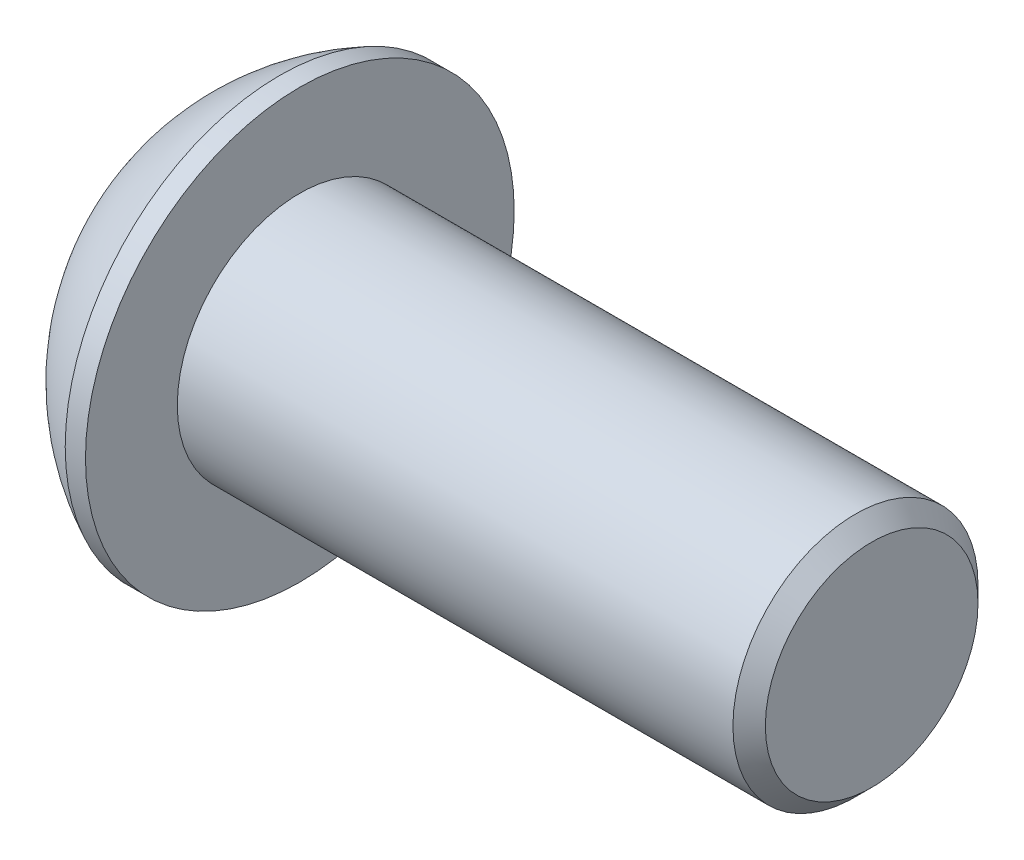
ISO-10303-21;
HEADER;
FILE_DESCRIPTION(('STEP AP214'),'2;1');
FILE_NAME('part.step','',(''),(''),'','','');
FILE_SCHEMA(('AUTOMOTIVE_DESIGN { 1 0 10303 214 1 1 1 1 }'));
ENDSEC;
DATA;
#1=APPLICATION_CONTEXT('core data for automotive mechanical design processes');
#2=APPLICATION_PROTOCOL_DEFINITION('international standard','automotive_design',2000,#1);
#3=PRODUCT_CONTEXT('',#1,'mechanical');
#4=PRODUCT('Part','Part','',(#3));
#5=PRODUCT_RELATED_PRODUCT_CATEGORY('part','',(#4));
#6=PRODUCT_DEFINITION_FORMATION('','',#4);
#7=PRODUCT_DEFINITION_CONTEXT('part definition',#1,'design');
#8=PRODUCT_DEFINITION('design','',#6,#7);
#9=PRODUCT_DEFINITION_SHAPE('','',#8);
#10=(LENGTH_UNIT() NAMED_UNIT(*) SI_UNIT(.MILLI.,.METRE.));
#11=(NAMED_UNIT(*) PLANE_ANGLE_UNIT() SI_UNIT($,.RADIAN.));
#12=(NAMED_UNIT(*) SI_UNIT($,.STERADIAN.) SOLID_ANGLE_UNIT());
#13=UNCERTAINTY_MEASURE_WITH_UNIT(LENGTH_MEASURE(1.E-05),#10,'distance_accuracy_value','');
#14=(GEOMETRIC_REPRESENTATION_CONTEXT(3) GLOBAL_UNCERTAINTY_ASSIGNED_CONTEXT((#13)) GLOBAL_UNIT_ASSIGNED_CONTEXT((#10,
#11,#12)) REPRESENTATION_CONTEXT('',''));
#15=CARTESIAN_POINT('',(0.,0.,0.));
#16=DIRECTION('',(0.,0.,1.));
#17=DIRECTION('',(1.,0.,0.));
#18=AXIS2_PLACEMENT_3D('',#15,#16,#17);
#19=CARTESIAN_POINT('',(0.,0.,0.));
#20=DIRECTION('',(-1.,0.,0.));
#21=DIRECTION('',(0.,0.,1.));
#22=AXIS2_PLACEMENT_3D('',#19,#20,#21);
#23=PLANE('',#22);
#24=CARTESIAN_POINT('',(0.,0.,0.));
#25=DIRECTION('',(-1.,0.,0.));
#26=DIRECTION('',(0.,0.,1.));
#27=AXIS2_PLACEMENT_3D('',#24,#25,#26);
#28=CIRCLE('',#27,4.1656);
#29=CARTESIAN_POINT('',(0.,4.1656,0.));
#30=VERTEX_POINT('',#29);
#31=EDGE_CURVE('E11',#30,#30,#28,.T.);
#32=ORIENTED_EDGE('',*,*,#31,.T.);
#33=EDGE_LOOP('',(#32));
#34=FACE_BOUND('',#33,.T.);
#35=DIRECTION('',(0.,-1.,0.));
#36=VECTOR('',#35,1.);
#37=CARTESIAN_POINT('',(0.,-1.6057843036971,2.7813));
#38=LINE('',#37,#36);
#39=CARTESIAN_POINT('',(0.,1.60578430369711,2.7813));
#40=VERTEX_POINT('',#39);
#41=CARTESIAN_POINT('',(0.,-1.6057843036971,2.7813));
#42=VERTEX_POINT('',#41);
#43=EDGE_CURVE('E46',#40,#42,#38,.T.);
#44=ORIENTED_EDGE('',*,*,#43,.T.);
#45=DIRECTION('',(0.,-0.500000000000001,-0.866025403784438));
#46=VECTOR('',#45,1.);
#47=CARTESIAN_POINT('',(0.,-3.21156860739421,0.));
#48=LINE('',#47,#46);
#49=CARTESIAN_POINT('',(0.,-3.21156860739421,0.));
#50=VERTEX_POINT('',#49);
#51=EDGE_CURVE('E362',#42,#50,#48,.T.);
#52=ORIENTED_EDGE('',*,*,#51,.T.);
#53=DIRECTION('',(0.,0.5,-0.866025403784438));
#54=VECTOR('',#53,1.);
#55=CARTESIAN_POINT('',(0.,-1.6057843036971,-2.7813));
#56=LINE('',#55,#54);
#57=CARTESIAN_POINT('',(0.,-1.6057843036971,-2.7813));
#58=VERTEX_POINT('',#57);
#59=EDGE_CURVE('E126',#50,#58,#56,.T.);
#60=ORIENTED_EDGE('',*,*,#59,.T.);
#61=DIRECTION('',(0.,1.,0.));
#62=VECTOR('',#61,1.);
#63=CARTESIAN_POINT('',(0.,1.60578430369711,-2.7813));
#64=LINE('',#63,#62);
#65=CARTESIAN_POINT('',(0.,1.60578430369711,-2.7813));
#66=VERTEX_POINT('',#65);
#67=EDGE_CURVE('E365',#58,#66,#64,.T.);
#68=ORIENTED_EDGE('',*,*,#67,.T.);
#69=DIRECTION('',(0.,0.499999999999999,0.866025403784439));
#70=VECTOR('',#69,1.);
#71=CARTESIAN_POINT('',(0.,3.21156860739421,0.));
#72=LINE('',#71,#70);
#73=CARTESIAN_POINT('',(0.,3.21156860739421,0.));
#74=VERTEX_POINT('',#73);
#75=EDGE_CURVE('E367',#66,#74,#72,.T.);
#76=ORIENTED_EDGE('',*,*,#75,.T.);
#77=DIRECTION('',(0.,-0.499999999999999,0.866025403784439));
#78=VECTOR('',#77,1.);
#79=CARTESIAN_POINT('',(0.,1.60578430369711,2.7813));
#80=LINE('',#79,#78);
#81=EDGE_CURVE('E369',#74,#40,#80,.T.);
#82=ORIENTED_EDGE('',*,*,#81,.T.);
#83=EDGE_LOOP('',(#44,#52,#60,#68,#76,#82));
#84=FACE_BOUND('',#83,.T.);
#85=ADVANCED_FACE('F32',(#34,#84),#23,.T.);
#86=CARTESIAN_POINT('',(8.23322857142858,0.,0.));
#87=DIRECTION('',(-1.,0.,0.));
#88=DIRECTION('',(0.,1.,0.));
#89=AXIS2_PLACEMENT_3D('',#86,#87,#88);
#90=SPHERICAL_SURFACE('',#89,9.22704048270018);
#91=CARTESIAN_POINT('',(4.2672,0.,0.));
#92=DIRECTION('',(-1.,0.,0.));
#93=DIRECTION('',(0.,0.,1.));
#94=AXIS2_PLACEMENT_3D('',#91,#92,#93);
#95=CIRCLE('',#94,8.3312);
#96=CARTESIAN_POINT('',(4.2672,8.3312,0.));
#97=VERTEX_POINT('',#96);
#98=EDGE_CURVE('E39',#97,#97,#95,.T.);
#99=CARTESIAN_POINT('',(4.2672,8.3312,0.));
#100=CARTESIAN_POINT('',(4.21008789706775,8.30401216143445,0.));
#101=CARTESIAN_POINT('',(4.15325544879328,8.27623687717214,0.));
#102=CARTESIAN_POINT('',(4.04017370315191,8.21952355207569,0.));
#103=CARTESIAN_POINT('',(3.983924405785,8.19058551124157,0.));
#104=CARTESIAN_POINT('',(3.87203280355074,8.13155880782323,0.));
#105=CARTESIAN_POINT('',(3.81639049868339,8.10147014523901,0.));
#106=CARTESIAN_POINT('',(3.70573640024065,8.04015495154151,0.));
#107=CARTESIAN_POINT('',(3.65072460666526,8.00892842042822,0.));
#108=CARTESIAN_POINT('',(3.54135480064451,7.94535068882439,0.));
#109=CARTESIAN_POINT('',(3.48699678819915,7.91299948833385,0.));
#110=CARTESIAN_POINT('',(3.37895753302873,7.84718610224342,0.));
#111=CARTESIAN_POINT('',(3.32527629030366,7.81372391664353,0.));
#112=CARTESIAN_POINT('',(3.21861327820971,7.74570271193545,0.));
#113=CARTESIAN_POINT('',(3.16563150884082,7.71114369282725,0.));
#114=CARTESIAN_POINT('',(3.06038985092671,7.6409434372658,0.));
#115=CARTESIAN_POINT('',(3.00812996238149,7.60530220081255,0.));
#116=CARTESIAN_POINT('',(2.90435416836898,7.53295258424359,0.));
#117=CARTESIAN_POINT('',(2.85283826290169,7.49624420412788,0.));
#118=CARTESIAN_POINT('',(2.75057222262265,7.42177582529164,0.));
#119=CARTESIAN_POINT('',(2.69982208781091,7.3840158265711,0.));
#120=CARTESIAN_POINT('',(2.59910905256031,7.30746018033003,0.));
#121=CARTESIAN_POINT('',(2.54914615212146,7.2686645328095,0.));
#122=CARTESIAN_POINT('',(2.45002871638783,7.1900539967829,0.));
#123=CARTESIAN_POINT('',(2.40087418109305,7.15023910827685,0.));
#124=CARTESIAN_POINT('',(2.30339426453793,7.06960692915957,0.));
#125=CARTESIAN_POINT('',(2.2550688832776,7.02878963854836,0.));
#126=CARTESIAN_POINT('',(2.15926771300816,6.94616991804654,0.));
#127=CARTESIAN_POINT('',(2.11179192399904,6.90436748815593,0.));
#128=CARTESIAN_POINT('',(2.01771001713144,6.81979516856526,0.));
#129=CARTESIAN_POINT('',(1.97110389927294,6.77702527886518,0.));
#130=CARTESIAN_POINT('',(1.87878104579659,6.69053612829253,0.));
#131=CARTESIAN_POINT('',(1.83306431017874,6.64681686741995,0.));
#132=CARTESIAN_POINT('',(1.74253955612797,6.5584474646561,0.));
#133=CARTESIAN_POINT('',(1.69773153769504,6.51379732276482,0.));
#134=CARTESIAN_POINT('',(1.60904316863532,6.42358504181417,0.));
#135=CARTESIAN_POINT('',(1.56516281800852,6.37802290275479,0.));
#136=CARTESIAN_POINT('',(1.47834834284443,6.28600589702881,0.));
#137=CARTESIAN_POINT('',(1.43541421830713,6.2395510303622,0.));
#138=CARTESIAN_POINT('',(1.3505103534187,6.14576821654324,0.));
#139=CARTESIAN_POINT('',(1.30854061306758,6.09844026939089,0.));
#140=CARTESIAN_POINT('',(1.22558326678196,6.00293131097316,0.));
#141=CARTESIAN_POINT('',(1.18459566084746,5.95475029970778,0.));
#142=CARTESIAN_POINT('',(1.10361991825197,5.85755559022261,0.));
#143=CARTESIAN_POINT('',(1.06363178159097,5.80854189200282,0.));
#144=CARTESIAN_POINT('',(0.984671889695452,5.70970253793459,0.));
#145=CARTESIAN_POINT('',(0.945700134460941,5.65987688208615,0.));
#146=CARTESIAN_POINT('',(0.868789487710526,5.55943468548888,0.));
#147=CARTESIAN_POINT('',(0.830850596194622,5.50881814474005,0.));
#148=CARTESIAN_POINT('',(0.756021722358178,5.4068155855517,0.));
#149=CARTESIAN_POINT('',(0.719131740037639,5.35542956711219,0.));
#150=CARTESIAN_POINT('',(0.646416286406143,5.25190978521245,0.));
#151=CARTESIAN_POINT('',(0.610590815095188,5.19977602175222,0.));
#152=CARTESIAN_POINT('',(0.540019535264,5.09478279862862,0.));
#153=CARTESIAN_POINT('',(0.505273726743766,5.04192333896525,0.));
#154=CARTESIAN_POINT('',(0.436876466983366,4.93550107952797,0.));
#155=CARTESIAN_POINT('',(0.403225015743199,4.88193827975407,0.));
#156=CARTESIAN_POINT('',(0.33703070470015,4.77413199231942,0.));
#157=CARTESIAN_POINT('',(0.304487844897267,4.71988850465868,0.));
#158=CARTESIAN_POINT('',(0.240524472686832,4.61074378652808,0.));
#159=CARTESIAN_POINT('',(0.20910396027928,4.55584255605823,0.));
#160=CARTESIAN_POINT('',(0.147398599014198,4.44540555701293,0.));
#161=CARTESIAN_POINT('',(0.117113750156668,4.38986978843748,0.));
#162=CARTESIAN_POINT('',(0.0576924217037253,4.27818725548947,0.));
#163=CARTESIAN_POINT('',(0.0285559421083116,4.2220404911169,0.));
#164=CARTESIAN_POINT('',(0.,4.1656,0.));
#165=B_SPLINE_CURVE_WITH_KNOTS('',3,(#99,#100,#101,#102,#103,#104,#105,#106,#107,#108,#109,#110,
#111,#112,#113,#114,#115,#116,#117,#118,#119,#120,#121,#122,#123,#124,#125,#126,#127,#128,#129,
#130,#131,#132,#133,#134,#135,#136,#137,#138,#139,#140,#141,#142,#143,#144,#145,#146,#147,#148,
#149,#150,#151,#152,#153,#154,#155,#156,#157,#158,#159,#160,#161,#162,#163,#164),.UNSPECIFIED.,
.F.,.F.,(4,2,2,2,2,2,2,2,2,2,2,2,2,2,2,2,2,2,2,2,2,2,2,2,2,2,2,2,2,2,2,2,4),(0.,
0.189756334389452,0.379512668778904,0.569269003168357,0.75902533755781,0.948781671947263,
1.13853800633672,1.32829434072617,1.51805067511562,1.70780700950507,1.89756334389453,
2.08731967828398,2.27707601267343,2.46683234706288,2.65658868145234,2.84634501584179,
3.03610135023124,3.22585768462069,3.41561401901015,3.6053703533996,3.79512668778905,
3.9848830221785,4.17463935656796,4.36439569095741,4.55415202534686,4.74390835973631,
4.93366469412577,5.12342102851522,5.31317736290467,5.50293369729413,5.69269003168358,
5.88244636607303,6.07220270046248),.UNSPECIFIED.);
#166=EDGE_CURVE('BSEAM153',#97,#30,#165,.T.);
#167=ORIENTED_EDGE('',*,*,#98,.T.);
#168=ORIENTED_EDGE('',*,*,#31,.F.);
#169=ORIENTED_EDGE('',*,*,#166,.T.);
#170=ORIENTED_EDGE('',*,*,#166,.F.);
#171=EDGE_LOOP('',(#167,#169,#168,#170));
#172=FACE_BOUND('',#171,.T.);
#173=ADVANCED_FACE('F153',(#172),#90,.T.);
#174=CARTESIAN_POINT('',(0.,0.,0.));
#175=DIRECTION('',(-1.,0.,0.));
#176=DIRECTION('',(0.,0.,1.));
#177=AXIS2_PLACEMENT_3D('',#174,#175,#176);
#178=CYLINDRICAL_SURFACE('',#177,8.3312);
#179=ORIENTED_EDGE('',*,*,#98,.F.);
#180=EDGE_LOOP('',(#179));
#181=FACE_BOUND('',#180,.T.);
#182=CARTESIAN_POINT('',(5.0546,0.,0.));
#183=DIRECTION('',(-1.,0.,0.));
#184=DIRECTION('',(0.,0.,1.));
#185=AXIS2_PLACEMENT_3D('',#182,#183,#184);
#186=CIRCLE('',#185,8.3312);
#187=CARTESIAN_POINT('',(5.0546,0.,8.3312));
#188=VERTEX_POINT('',#187);
#189=EDGE_CURVE('E148',#188,#188,#186,.T.);
#190=ORIENTED_EDGE('',*,*,#189,.T.);
#191=EDGE_LOOP('',(#190));
#192=FACE_BOUND('',#191,.T.);
#193=ADVANCED_FACE('F156',(#181,#192),#178,.T.);
#194=CARTESIAN_POINT('',(5.0546,4.7625,0.));
#195=DIRECTION('',(-1.,0.,0.));
#196=DIRECTION('',(0.,0.,1.));
#197=AXIS2_PLACEMENT_3D('',#194,#195,#196);
#198=PLANE('',#197);
#199=ORIENTED_EDGE('',*,*,#189,.F.);
#200=EDGE_LOOP('',(#199));
#201=FACE_BOUND('',#200,.T.);
#202=CARTESIAN_POINT('',(5.0546,0.,0.));
#203=DIRECTION('',(-1.,0.,0.));
#204=DIRECTION('',(0.,0.,1.));
#205=AXIS2_PLACEMENT_3D('',#202,#203,#204);
#206=CIRCLE('',#205,4.7625);
#207=CARTESIAN_POINT('',(5.0546,0.,4.7625));
#208=VERTEX_POINT('',#207);
#209=EDGE_CURVE('E145',#208,#208,#206,.T.);
#210=ORIENTED_EDGE('',*,*,#209,.T.);
#211=EDGE_LOOP('',(#210));
#212=FACE_BOUND('',#211,.T.);
#213=ADVANCED_FACE('F159',(#201,#212),#198,.F.);
#214=CARTESIAN_POINT('',(0.,0.,0.));
#215=DIRECTION('',(-1.,0.,0.));
#216=DIRECTION('',(0.,0.,1.));
#217=AXIS2_PLACEMENT_3D('',#214,#215,#216);
#218=CYLINDRICAL_SURFACE('',#217,4.7625);
#219=ORIENTED_EDGE('',*,*,#209,.F.);
#220=EDGE_LOOP('',(#219));
#221=FACE_BOUND('',#220,.T.);
#222=CARTESIAN_POINT('',(26.64968,0.,0.));
#223=DIRECTION('',(-1.,0.,0.));
#224=DIRECTION('',(0.,0.,1.));
#225=AXIS2_PLACEMENT_3D('',#222,#223,#224);
#226=CIRCLE('',#225,4.7625);
#227=CARTESIAN_POINT('',(26.64968,0.,4.7625));
#228=VERTEX_POINT('',#227);
#229=EDGE_CURVE('E142',#228,#228,#226,.T.);
#230=ORIENTED_EDGE('',*,*,#229,.T.);
#231=EDGE_LOOP('',(#230));
#232=FACE_BOUND('',#231,.T.);
#233=ADVANCED_FACE('F165',(#221,#232),#218,.T.);
#234=CARTESIAN_POINT('',(27.2796,0.,0.));
#235=DIRECTION('',(-1.,0.,0.));
#236=DIRECTION('',(0.,0.,1.));
#237=AXIS2_PLACEMENT_3D('',#234,#235,#236);
#238=CONICAL_SURFACE('',#237,4.13258,0.785398163397461);
#239=ORIENTED_EDGE('',*,*,#229,.F.);
#240=EDGE_LOOP('',(#239));
#241=FACE_BOUND('',#240,.T.);
#242=CARTESIAN_POINT('',(27.2796,0.,0.));
#243=DIRECTION('',(-1.,0.,0.));
#244=DIRECTION('',(0.,0.,1.));
#245=AXIS2_PLACEMENT_3D('',#242,#243,#244);
#246=CIRCLE('',#245,4.13258);
#247=CARTESIAN_POINT('',(27.2796,0.,4.13258));
#248=VERTEX_POINT('',#247);
#249=EDGE_CURVE('E138',#248,#248,#246,.T.);
#250=ORIENTED_EDGE('',*,*,#249,.T.);
#251=EDGE_LOOP('',(#250));
#252=FACE_BOUND('',#251,.T.);
#253=ADVANCED_FACE('F171',(#241,#252),#238,.T.);
#254=CARTESIAN_POINT('',(27.2796,0.,0.));
#255=DIRECTION('',(-1.,0.,0.));
#256=DIRECTION('',(0.,0.,1.));
#257=AXIS2_PLACEMENT_3D('',#254,#255,#256);
#258=PLANE('',#257);
#259=ORIENTED_EDGE('',*,*,#249,.F.);
#260=EDGE_LOOP('',(#259));
#261=FACE_BOUND('',#260,.T.);
#262=ADVANCED_FACE('F177',(#261),#258,.F.);
#263=CARTESIAN_POINT('',(3.0988,-3.21156860739421,0.));
#264=DIRECTION('',(0.,0.866025403784438,-0.500000000000001));
#265=DIRECTION('',(0.,0.500000000000001,0.866025403784438));
#266=AXIS2_PLACEMENT_3D('',#263,#264,#265);
#267=PLANE('',#266);
#268=DIRECTION('',(0.,-0.500000000000001,-0.866025403784438));
#269=VECTOR('',#268,1.);
#270=CARTESIAN_POINT('',(3.0988,-3.21156860739421,0.));
#271=LINE('',#270,#269);
#272=CARTESIAN_POINT('',(3.0988,-1.6057843036971,2.7813));
#273=VERTEX_POINT('',#272);
#274=CARTESIAN_POINT('',(3.0988,-2.40867645554566,1.39065));
#275=VERTEX_POINT('',#274);
#276=EDGE_CURVE('E112',#273,#275,#271,.T.);
#277=ORIENTED_EDGE('',*,*,#276,.T.);
#278=CARTESIAN_POINT('',(3.0988,-3.21156860739421,0.));
#279=VERTEX_POINT('',#278);
#280=EDGE_CURVE('E107',#275,#279,#271,.T.);
#281=ORIENTED_EDGE('',*,*,#280,.T.);
#282=DIRECTION('',(-1.,0.,0.));
#283=VECTOR('',#282,1.);
#284=CARTESIAN_POINT('',(3.0988,-3.21156860739421,0.));
#285=LINE('',#284,#283);
#286=EDGE_CURVE('E109',#279,#50,#285,.T.);
#287=ORIENTED_EDGE('',*,*,#286,.T.);
#288=ORIENTED_EDGE('',*,*,#51,.F.);
#289=DIRECTION('',(-1.,0.,0.));
#290=VECTOR('',#289,1.);
#291=CARTESIAN_POINT('',(3.0988,-1.6057843036971,2.7813));
#292=LINE('',#291,#290);
#293=EDGE_CURVE('E357',#273,#42,#292,.T.);
#294=ORIENTED_EDGE('',*,*,#293,.F.);
#295=EDGE_LOOP('',(#277,#281,#287,#288,#294));
#296=FACE_BOUND('',#295,.T.);
#297=ADVANCED_FACE('F108',(#296),#267,.T.);
#298=CARTESIAN_POINT('',(3.0988,-1.6057843036971,-2.7813));
#299=DIRECTION('',(0.,0.866025403784438,0.5));
#300=DIRECTION('',(0.,-0.5,0.866025403784438));
#301=AXIS2_PLACEMENT_3D('',#298,#299,#300);
#302=PLANE('',#301);
#303=DIRECTION('',(0.,0.5,-0.866025403784438));
#304=VECTOR('',#303,1.);
#305=CARTESIAN_POINT('',(3.0988,-1.6057843036971,-2.7813));
#306=LINE('',#305,#304);
#307=CARTESIAN_POINT('',(3.0988,-2.40867645554566,-1.39065));
#308=VERTEX_POINT('',#307);
#309=EDGE_CURVE('E54',#279,#308,#306,.T.);
#310=ORIENTED_EDGE('',*,*,#309,.T.);
#311=CARTESIAN_POINT('',(3.0988,-1.6057843036971,-2.7813));
#312=VERTEX_POINT('',#311);
#313=EDGE_CURVE('E121',#308,#312,#306,.T.);
#314=ORIENTED_EDGE('',*,*,#313,.T.);
#315=DIRECTION('',(-1.,0.,0.));
#316=VECTOR('',#315,1.);
#317=CARTESIAN_POINT('',(3.0988,-1.6057843036971,-2.7813));
#318=LINE('',#317,#316);
#319=EDGE_CURVE('E128',#312,#58,#318,.T.);
#320=ORIENTED_EDGE('',*,*,#319,.T.);
#321=ORIENTED_EDGE('',*,*,#59,.F.);
#322=ORIENTED_EDGE('',*,*,#286,.F.);
#323=EDGE_LOOP('',(#310,#314,#320,#321,#322));
#324=FACE_BOUND('',#323,.T.);
#325=ADVANCED_FACE('F124',(#324),#302,.T.);
#326=CARTESIAN_POINT('',(3.0988,1.60578430369711,-2.7813));
#327=DIRECTION('',(0.,0.,1.));
#328=DIRECTION('',(0.,-1.,0.));
#329=AXIS2_PLACEMENT_3D('',#326,#327,#328);
#330=PLANE('',#329);
#331=DIRECTION('',(0.,1.,0.));
#332=VECTOR('',#331,1.);
#333=CARTESIAN_POINT('',(3.0988,1.60578430369711,-2.7813));
#334=LINE('',#333,#332);
#335=CARTESIAN_POINT('',(3.0988,0.,-2.7813));
#336=VERTEX_POINT('',#335);
#337=EDGE_CURVE('E387',#312,#336,#334,.T.);
#338=ORIENTED_EDGE('',*,*,#337,.T.);
#339=CARTESIAN_POINT('',(3.0988,1.60578430369711,-2.7813));
#340=VERTEX_POINT('',#339);
#341=EDGE_CURVE('E120',#336,#340,#334,.T.);
#342=ORIENTED_EDGE('',*,*,#341,.T.);
#343=DIRECTION('',(-1.,0.,0.));
#344=VECTOR('',#343,1.);
#345=CARTESIAN_POINT('',(3.0988,1.60578430369711,-2.7813));
#346=LINE('',#345,#344);
#347=EDGE_CURVE('E133',#340,#66,#346,.T.);
#348=ORIENTED_EDGE('',*,*,#347,.T.);
#349=ORIENTED_EDGE('',*,*,#67,.F.);
#350=ORIENTED_EDGE('',*,*,#319,.F.);
#351=EDGE_LOOP('',(#338,#342,#348,#349,#350));
#352=FACE_BOUND('',#351,.T.);
#353=ADVANCED_FACE('F236',(#352),#330,.T.);
#354=CARTESIAN_POINT('',(3.0988,3.21156860739421,0.));
#355=DIRECTION('',(0.,-0.866025403784439,0.5));
#356=DIRECTION('',(0.,-0.5,-0.866025403784439));
#357=AXIS2_PLACEMENT_3D('',#354,#355,#356);
#358=PLANE('',#357);
#359=DIRECTION('',(0.,0.499999999999999,0.866025403784439));
#360=VECTOR('',#359,1.);
#361=CARTESIAN_POINT('',(3.0988,3.21156860739421,0.));
#362=LINE('',#361,#360);
#363=CARTESIAN_POINT('',(3.0988,2.40867645554566,-1.39065));
#364=VERTEX_POINT('',#363);
#365=EDGE_CURVE('E391',#340,#364,#362,.T.);
#366=ORIENTED_EDGE('',*,*,#365,.T.);
#367=CARTESIAN_POINT('',(3.0988,3.21156860739421,0.));
#368=VERTEX_POINT('',#367);
#369=EDGE_CURVE('E389',#364,#368,#362,.T.);
#370=ORIENTED_EDGE('',*,*,#369,.T.);
#371=DIRECTION('',(-1.,0.,0.));
#372=VECTOR('',#371,1.);
#373=CARTESIAN_POINT('',(3.0988,3.21156860739421,0.));
#374=LINE('',#373,#372);
#375=EDGE_CURVE('E373',#368,#74,#374,.T.);
#376=ORIENTED_EDGE('',*,*,#375,.T.);
#377=ORIENTED_EDGE('',*,*,#75,.F.);
#378=ORIENTED_EDGE('',*,*,#347,.F.);
#379=EDGE_LOOP('',(#366,#370,#376,#377,#378));
#380=FACE_BOUND('',#379,.T.);
#381=ADVANCED_FACE('F245',(#380),#358,.T.);
#382=CARTESIAN_POINT('',(3.0988,1.60578430369711,2.7813));
#383=DIRECTION('',(0.,-0.866025403784439,-0.499999999999999));
#384=DIRECTION('',(0.,0.499999999999999,-0.866025403784439));
#385=AXIS2_PLACEMENT_3D('',#382,#383,#384);
#386=PLANE('',#385);
#387=DIRECTION('',(0.,-0.499999999999999,0.866025403784439));
#388=VECTOR('',#387,1.);
#389=CARTESIAN_POINT('',(3.0988,1.60578430369711,2.7813));
#390=LINE('',#389,#388);
#391=CARTESIAN_POINT('',(3.0988,2.40867645554566,1.39065));
#392=VERTEX_POINT('',#391);
#393=EDGE_CURVE('E352',#368,#392,#390,.T.);
#394=ORIENTED_EDGE('',*,*,#393,.T.);
#395=CARTESIAN_POINT('',(3.0988,1.60578430369711,2.7813));
#396=VERTEX_POINT('',#395);
#397=EDGE_CURVE('E348',#392,#396,#390,.T.);
#398=ORIENTED_EDGE('',*,*,#397,.T.);
#399=DIRECTION('',(-1.,0.,0.));
#400=VECTOR('',#399,1.);
#401=CARTESIAN_POINT('',(3.0988,1.60578430369711,2.7813));
#402=LINE('',#401,#400);
#403=EDGE_CURVE('E356',#396,#40,#402,.T.);
#404=ORIENTED_EDGE('',*,*,#403,.T.);
#405=ORIENTED_EDGE('',*,*,#81,.F.);
#406=ORIENTED_EDGE('',*,*,#375,.F.);
#407=EDGE_LOOP('',(#394,#398,#404,#405,#406));
#408=FACE_BOUND('',#407,.T.);
#409=ADVANCED_FACE('F255',(#408),#386,.T.);
#410=CARTESIAN_POINT('',(3.0988,-1.6057843036971,2.7813));
#411=DIRECTION('',(0.,0.,-1.));
#412=DIRECTION('',(0.,1.,0.));
#413=AXIS2_PLACEMENT_3D('',#410,#411,#412);
#414=PLANE('',#413);
#415=DIRECTION('',(0.,-1.,0.));
#416=VECTOR('',#415,1.);
#417=CARTESIAN_POINT('',(3.0988,-1.6057843036971,2.7813));
#418=LINE('',#417,#416);
#419=CARTESIAN_POINT('',(3.0988,0.,2.7813));
#420=VERTEX_POINT('',#419);
#421=EDGE_CURVE('E347',#396,#420,#418,.T.);
#422=ORIENTED_EDGE('',*,*,#421,.T.);
#423=EDGE_CURVE('E350',#420,#273,#418,.T.);
#424=ORIENTED_EDGE('',*,*,#423,.T.);
#425=ORIENTED_EDGE('',*,*,#293,.T.);
#426=ORIENTED_EDGE('',*,*,#43,.F.);
#427=ORIENTED_EDGE('',*,*,#403,.F.);
#428=EDGE_LOOP('',(#422,#424,#425,#426,#427));
#429=FACE_BOUND('',#428,.T.);
#430=ADVANCED_FACE('F265',(#429),#414,.T.);
#431=CARTESIAN_POINT('',(3.0988,-3.21156860739421,0.));
#432=DIRECTION('',(1.,0.,0.));
#433=DIRECTION('',(0.,0.,-1.));
#434=AXIS2_PLACEMENT_3D('',#431,#432,#433);
#435=PLANE('',#434);
#436=CARTESIAN_POINT('',(3.0988,0.,0.));
#437=DIRECTION('',(-1.,0.,0.));
#438=DIRECTION('',(0.,0.,1.));
#439=AXIS2_PLACEMENT_3D('',#436,#437,#438);
#440=CIRCLE('',#439,2.7813);
#441=EDGE_CURVE('E394',#364,#336,#440,.T.);
#442=ORIENTED_EDGE('',*,*,#441,.F.);
#443=ORIENTED_EDGE('',*,*,#365,.F.);
#444=ORIENTED_EDGE('',*,*,#341,.F.);
#445=EDGE_LOOP('',(#442,#443,#444));
#446=FACE_BOUND('',#445,.T.);
#447=ADVANCED_FACE('F275',(#446),#435,.F.);
#448=EDGE_CURVE('E139',#392,#364,#440,.T.);
#449=ORIENTED_EDGE('',*,*,#448,.F.);
#450=ORIENTED_EDGE('',*,*,#393,.F.);
#451=ORIENTED_EDGE('',*,*,#369,.F.);
#452=EDGE_LOOP('',(#449,#450,#451));
#453=FACE_BOUND('',#452,.T.);
#454=ADVANCED_FACE('F285',(#453),#435,.F.);
#455=EDGE_CURVE('E132',#420,#392,#440,.T.);
#456=ORIENTED_EDGE('',*,*,#455,.F.);
#457=ORIENTED_EDGE('',*,*,#421,.F.);
#458=ORIENTED_EDGE('',*,*,#397,.F.);
#459=EDGE_LOOP('',(#456,#457,#458));
#460=FACE_BOUND('',#459,.T.);
#461=ADVANCED_FACE('F296',(#460),#435,.F.);
#462=EDGE_CURVE('E127',#275,#420,#440,.T.);
#463=ORIENTED_EDGE('',*,*,#462,.F.);
#464=ORIENTED_EDGE('',*,*,#276,.F.);
#465=ORIENTED_EDGE('',*,*,#423,.F.);
#466=EDGE_LOOP('',(#463,#464,#465));
#467=FACE_BOUND('',#466,.T.);
#468=ADVANCED_FACE('F305',(#467),#435,.F.);
#469=EDGE_CURVE('E118',#308,#275,#440,.T.);
#470=ORIENTED_EDGE('',*,*,#469,.F.);
#471=ORIENTED_EDGE('',*,*,#309,.F.);
#472=ORIENTED_EDGE('',*,*,#280,.F.);
#473=EDGE_LOOP('',(#470,#471,#472));
#474=FACE_BOUND('',#473,.T.);
#475=ADVANCED_FACE('F117',(#474),#435,.F.);
#476=EDGE_CURVE('E388',#336,#308,#440,.T.);
#477=ORIENTED_EDGE('',*,*,#476,.F.);
#478=ORIENTED_EDGE('',*,*,#337,.F.);
#479=ORIENTED_EDGE('',*,*,#313,.F.);
#480=EDGE_LOOP('',(#477,#478,#479));
#481=FACE_BOUND('',#480,.T.);
#482=ADVANCED_FACE('F288',(#481),#435,.F.);
#483=CARTESIAN_POINT('',(4.70458430369712,0.,0.));
#484=DIRECTION('',(-1.,0.,0.));
#485=DIRECTION('',(0.,0.,1.));
#486=AXIS2_PLACEMENT_3D('',#483,#484,#485);
#487=CONICAL_SURFACE('',#486,0.,1.04719755119659);
#488=ORIENTED_EDGE('',*,*,#455,.T.);
#489=ORIENTED_EDGE('',*,*,#448,.T.);
#490=ORIENTED_EDGE('',*,*,#441,.T.);
#491=ORIENTED_EDGE('',*,*,#476,.T.);
#492=ORIENTED_EDGE('',*,*,#469,.T.);
#493=ORIENTED_EDGE('',*,*,#462,.T.);
#494=EDGE_LOOP('',(#488,#489,#490,#491,#492,#493));
#495=FACE_BOUND('',#494,.T.);
#496=CARTESIAN_POINT('',(4.70458430369712,0.,0.));
#497=VERTEX_POINT('',#496);
#498=VERTEX_LOOP('',#497);
#499=FACE_BOUND('',#498,.T.);
#500=ADVANCED_FACE('F329',(#495,#499),#487,.F.);
#501=CLOSED_SHELL('',(#85,#173,#193,#213,#233,#253,#262,#297,#325,#353,#381,#409,#430,#447,#454,
#461,#468,#475,#482,#500));
#502=MANIFOLD_SOLID_BREP('B2',#501);
#503=ADVANCED_BREP_SHAPE_REPRESENTATION('',(#18,#502),#14);
#504=SHAPE_DEFINITION_REPRESENTATION(#9,#503);
ENDSEC;
END-ISO-10303-21;
